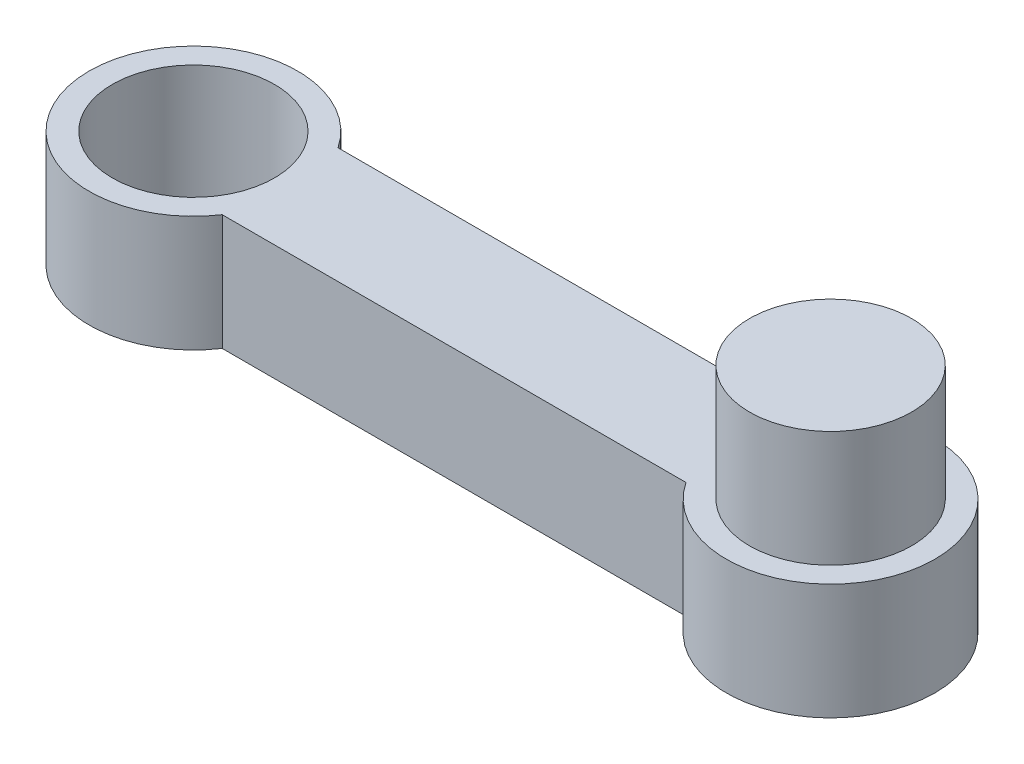
ISO-10303-21;
HEADER;
FILE_DESCRIPTION(('STEP AP214'),'2;1');
FILE_NAME('part.step','',(''),(''),'','','');
FILE_SCHEMA(('AUTOMOTIVE_DESIGN { 1 0 10303 214 1 1 1 1 }'));
ENDSEC;
DATA;
#1=APPLICATION_CONTEXT('core data for automotive mechanical design processes');
#2=APPLICATION_PROTOCOL_DEFINITION('international standard','automotive_design',2000,#1);
#3=PRODUCT_CONTEXT('',#1,'mechanical');
#4=PRODUCT('Part','Part','',(#3));
#5=PRODUCT_RELATED_PRODUCT_CATEGORY('part','',(#4));
#6=PRODUCT_DEFINITION_FORMATION('','',#4);
#7=PRODUCT_DEFINITION_CONTEXT('part definition',#1,'design');
#8=PRODUCT_DEFINITION('design','',#6,#7);
#9=PRODUCT_DEFINITION_SHAPE('','',#8);
#10=(LENGTH_UNIT() NAMED_UNIT(*) SI_UNIT(.MILLI.,.METRE.));
#11=(NAMED_UNIT(*) PLANE_ANGLE_UNIT() SI_UNIT($,.RADIAN.));
#12=(NAMED_UNIT(*) SI_UNIT($,.STERADIAN.) SOLID_ANGLE_UNIT());
#13=UNCERTAINTY_MEASURE_WITH_UNIT(LENGTH_MEASURE(1.E-05),#10,'distance_accuracy_value','');
#14=(GEOMETRIC_REPRESENTATION_CONTEXT(3) GLOBAL_UNCERTAINTY_ASSIGNED_CONTEXT((#13)) GLOBAL_UNIT_ASSIGNED_CONTEXT((#10,
#11,#12)) REPRESENTATION_CONTEXT('',''));
#15=CARTESIAN_POINT('',(0.,0.,0.));
#16=DIRECTION('',(0.,0.,1.));
#17=DIRECTION('',(1.,0.,0.));
#18=AXIS2_PLACEMENT_3D('',#15,#16,#17);
#19=CARTESIAN_POINT('',(-242.625717576026,100.,-175.992438563326));
#20=DIRECTION('',(1.,0.,-1.10744049325685E-13));
#21=DIRECTION('',(-1.10744049325685E-13,0.,-1.));
#22=AXIS2_PLACEMENT_3D('',#19,#20,#21);
#23=PLANE('',#22);
#24=DIRECTION('',(1.10744049325685E-13,0.,1.));
#25=VECTOR('',#24,1.);
#26=CARTESIAN_POINT('',(-242.625717576026,0.,-175.992438563326));
#27=LINE('',#26,#25);
#28=CARTESIAN_POINT('',(-242.625717576026,0.,-176.243066707995));
#29=VERTEX_POINT('',#28);
#30=CARTESIAN_POINT('',(-242.625717576026,0.,-175.992438563326));
#31=VERTEX_POINT('',#30);
#32=EDGE_CURVE('E146',#29,#31,#27,.T.);
#33=ORIENTED_EDGE('',*,*,#32,.T.);
#34=DIRECTION('',(0.,-1.,0.));
#35=VECTOR('',#34,1.);
#36=CARTESIAN_POINT('',(-242.625717576026,100.,-175.992438563326));
#37=LINE('',#36,#35);
#38=CARTESIAN_POINT('',(-242.625717576026,100.,-175.992438563326));
#39=VERTEX_POINT('',#38);
#40=EDGE_CURVE('E11',#39,#31,#37,.T.);
#41=ORIENTED_EDGE('',*,*,#40,.F.);
#42=DIRECTION('',(1.10744049325685E-13,0.,1.));
#43=VECTOR('',#42,1.);
#44=CARTESIAN_POINT('',(-242.625717576026,100.,-175.992438563326));
#45=LINE('',#44,#43);
#46=CARTESIAN_POINT('',(-242.625717576026,100.,-176.243066707995));
#47=VERTEX_POINT('',#46);
#48=EDGE_CURVE('E169',#47,#39,#45,.T.);
#49=ORIENTED_EDGE('',*,*,#48,.F.);
#50=DIRECTION('',(0.,-1.,0.));
#51=VECTOR('',#50,1.);
#52=CARTESIAN_POINT('',(-242.625717576026,100.,-176.243066707995));
#53=LINE('',#52,#51);
#54=EDGE_CURVE('E142',#47,#29,#53,.T.);
#55=ORIENTED_EDGE('',*,*,#54,.T.);
#56=EDGE_LOOP('',(#33,#41,#49,#55));
#57=FACE_BOUND('',#56,.T.);
#58=ADVANCED_FACE('F45',(#57),#23,.F.);
#59=CARTESIAN_POINT('',(-242.625717576026,100.,-175.992438563326));
#60=DIRECTION('',(0.,0.,-1.));
#61=DIRECTION('',(-1.,0.,0.));
#62=AXIS2_PLACEMENT_3D('',#59,#60,#61);
#63=PLANE('',#62);
#64=DIRECTION('',(1.,0.,0.));
#65=VECTOR('',#64,1.);
#66=CARTESIAN_POINT('',(-242.625717576026,0.,-175.992438563326));
#67=LINE('',#66,#65);
#68=CARTESIAN_POINT('',(157.374282423974,0.,-175.992438563326));
#69=VERTEX_POINT('',#68);
#70=EDGE_CURVE('E150',#31,#69,#67,.T.);
#71=ORIENTED_EDGE('',*,*,#70,.T.);
#72=DIRECTION('',(0.,-1.,0.));
#73=VECTOR('',#72,1.);
#74=CARTESIAN_POINT('',(157.374282423974,100.,-175.992438563326));
#75=LINE('',#74,#73);
#76=CARTESIAN_POINT('',(157.374282423974,100.,-175.992438563326));
#77=VERTEX_POINT('',#76);
#78=EDGE_CURVE('E54',#77,#69,#75,.T.);
#79=ORIENTED_EDGE('',*,*,#78,.F.);
#80=DIRECTION('',(1.,0.,0.));
#81=VECTOR('',#80,1.);
#82=CARTESIAN_POINT('',(-242.625717576026,100.,-175.992438563326));
#83=LINE('',#82,#81);
#84=EDGE_CURVE('E105',#39,#77,#83,.T.);
#85=ORIENTED_EDGE('',*,*,#84,.F.);
#86=ORIENTED_EDGE('',*,*,#40,.T.);
#87=EDGE_LOOP('',(#71,#79,#85,#86));
#88=FACE_BOUND('',#87,.T.);
#89=ADVANCED_FACE('F254',(#88),#63,.F.);
#90=CARTESIAN_POINT('',(157.374282423974,100.,-175.992438563326));
#91=DIRECTION('',(-1.,0.,0.));
#92=DIRECTION('',(0.,0.,1.));
#93=AXIS2_PLACEMENT_3D('',#90,#91,#92);
#94=PLANE('',#93);
#95=DIRECTION('',(0.,0.,-1.));
#96=VECTOR('',#95,1.);
#97=CARTESIAN_POINT('',(157.374282423974,0.,-175.992438563326));
#98=LINE('',#97,#96);
#99=CARTESIAN_POINT('',(157.374282423974,0.,-176.243066707995));
#100=VERTEX_POINT('',#99);
#101=EDGE_CURVE('E154',#69,#100,#98,.T.);
#102=ORIENTED_EDGE('',*,*,#101,.T.);
#103=DIRECTION('',(0.,-1.,0.));
#104=VECTOR('',#103,1.);
#105=CARTESIAN_POINT('',(157.374282423974,100.,-176.243066707995));
#106=LINE('',#105,#104);
#107=CARTESIAN_POINT('',(157.374282423974,100.,-176.243066707995));
#108=VERTEX_POINT('',#107);
#109=EDGE_CURVE('E180',#108,#100,#106,.T.);
#110=ORIENTED_EDGE('',*,*,#109,.F.);
#111=DIRECTION('',(0.,0.,-1.));
#112=VECTOR('',#111,1.);
#113=CARTESIAN_POINT('',(157.374282423974,100.,-175.992438563326));
#114=LINE('',#113,#112);
#115=EDGE_CURVE('E190',#77,#108,#114,.T.);
#116=ORIENTED_EDGE('',*,*,#115,.F.);
#117=ORIENTED_EDGE('',*,*,#78,.T.);
#118=EDGE_LOOP('',(#102,#110,#116,#117));
#119=FACE_BOUND('',#118,.T.);
#120=ADVANCED_FACE('F188',(#119),#94,.F.);
#121=CARTESIAN_POINT('',(232.374282423974,100.,-225.992438563326));
#122=DIRECTION('',(0.,-1.,0.));
#123=DIRECTION('',(0.,0.,-1.));
#124=AXIS2_PLACEMENT_3D('',#121,#122,#123);
#125=CYLINDRICAL_SURFACE('',#124,90.);
#126=CARTESIAN_POINT('',(232.374282423974,0.,-225.992438563326));
#127=DIRECTION('',(0.,1.,0.));
#128=DIRECTION('',(0.,0.,1.));
#129=AXIS2_PLACEMENT_3D('',#126,#127,#128);
#130=CIRCLE('',#129,90.);
#131=CARTESIAN_POINT('',(157.374282423974,0.,-275.741810418657));
#132=VERTEX_POINT('',#131);
#133=EDGE_CURVE('E157',#100,#132,#130,.T.);
#134=ORIENTED_EDGE('',*,*,#133,.T.);
#135=DIRECTION('',(0.,-1.,0.));
#136=VECTOR('',#135,1.);
#137=CARTESIAN_POINT('',(157.374282423974,100.,-275.741810418657));
#138=LINE('',#137,#136);
#139=CARTESIAN_POINT('',(157.374282423974,100.,-275.741810418657));
#140=VERTEX_POINT('',#139);
#141=EDGE_CURVE('E176',#140,#132,#138,.T.);
#142=ORIENTED_EDGE('',*,*,#141,.F.);
#143=CARTESIAN_POINT('',(232.374282423974,100.,-225.992438563326));
#144=DIRECTION('',(0.,1.,0.));
#145=DIRECTION('',(0.,0.,1.));
#146=AXIS2_PLACEMENT_3D('',#143,#144,#145);
#147=CIRCLE('',#146,90.);
#148=EDGE_CURVE('E203',#108,#140,#147,.T.);
#149=ORIENTED_EDGE('',*,*,#148,.F.);
#150=ORIENTED_EDGE('',*,*,#109,.T.);
#151=EDGE_LOOP('',(#134,#142,#149,#150));
#152=FACE_BOUND('',#151,.T.);
#153=ADVANCED_FACE('F198',(#152),#125,.T.);
#154=CARTESIAN_POINT('',(157.374282423974,100.,-275.741810418657));
#155=DIRECTION('',(-1.,0.,0.));
#156=DIRECTION('',(0.,0.,1.));
#157=AXIS2_PLACEMENT_3D('',#154,#155,#156);
#158=PLANE('',#157);
#159=DIRECTION('',(0.,0.,-1.));
#160=VECTOR('',#159,1.);
#161=CARTESIAN_POINT('',(157.374282423974,0.,-275.741810418657));
#162=LINE('',#161,#160);
#163=CARTESIAN_POINT('',(157.374282423974,0.,-275.992438563326));
#164=VERTEX_POINT('',#163);
#165=EDGE_CURVE('E160',#132,#164,#162,.T.);
#166=ORIENTED_EDGE('',*,*,#165,.T.);
#167=DIRECTION('',(0.,-1.,0.));
#168=VECTOR('',#167,1.);
#169=CARTESIAN_POINT('',(157.374282423974,100.,-275.992438563326));
#170=LINE('',#169,#168);
#171=CARTESIAN_POINT('',(157.374282423974,100.,-275.992438563326));
#172=VERTEX_POINT('',#171);
#173=EDGE_CURVE('E135',#172,#164,#170,.T.);
#174=ORIENTED_EDGE('',*,*,#173,.F.);
#175=DIRECTION('',(0.,0.,-1.));
#176=VECTOR('',#175,1.);
#177=CARTESIAN_POINT('',(157.374282423974,100.,-275.741810418657));
#178=LINE('',#177,#176);
#179=EDGE_CURVE('E124',#140,#172,#178,.T.);
#180=ORIENTED_EDGE('',*,*,#179,.F.);
#181=ORIENTED_EDGE('',*,*,#141,.T.);
#182=EDGE_LOOP('',(#166,#174,#180,#181));
#183=FACE_BOUND('',#182,.T.);
#184=ADVANCED_FACE('F201',(#183),#158,.F.);
#185=CARTESIAN_POINT('',(-242.625717576026,100.,-275.992438563326));
#186=DIRECTION('',(0.,0.,1.));
#187=DIRECTION('',(1.,0.,0.));
#188=AXIS2_PLACEMENT_3D('',#185,#186,#187);
#189=PLANE('',#188);
#190=DIRECTION('',(-1.,0.,0.));
#191=VECTOR('',#190,1.);
#192=CARTESIAN_POINT('',(-242.625717576026,0.,-275.992438563326));
#193=LINE('',#192,#191);
#194=CARTESIAN_POINT('',(-242.625717576026,0.,-275.992438563326));
#195=VERTEX_POINT('',#194);
#196=EDGE_CURVE('E133',#164,#195,#193,.T.);
#197=ORIENTED_EDGE('',*,*,#196,.T.);
#198=DIRECTION('',(0.,-1.,0.));
#199=VECTOR('',#198,1.);
#200=CARTESIAN_POINT('',(-242.625717576026,100.,-275.992438563326));
#201=LINE('',#200,#199);
#202=CARTESIAN_POINT('',(-242.625717576026,100.,-275.992438563326));
#203=VERTEX_POINT('',#202);
#204=EDGE_CURVE('E130',#203,#195,#201,.T.);
#205=ORIENTED_EDGE('',*,*,#204,.F.);
#206=DIRECTION('',(-1.,0.,0.));
#207=VECTOR('',#206,1.);
#208=CARTESIAN_POINT('',(-242.625717576026,100.,-275.992438563326));
#209=LINE('',#208,#207);
#210=EDGE_CURVE('E118',#172,#203,#209,.T.);
#211=ORIENTED_EDGE('',*,*,#210,.F.);
#212=ORIENTED_EDGE('',*,*,#173,.T.);
#213=EDGE_LOOP('',(#197,#205,#211,#212));
#214=FACE_BOUND('',#213,.T.);
#215=ADVANCED_FACE('F131',(#214),#189,.F.);
#216=CARTESIAN_POINT('',(-242.625717576026,100.,-275.741810418657));
#217=DIRECTION('',(1.,0.,0.));
#218=DIRECTION('',(0.,0.,-1.));
#219=AXIS2_PLACEMENT_3D('',#216,#217,#218);
#220=PLANE('',#219);
#221=DIRECTION('',(0.,0.,1.));
#222=VECTOR('',#221,1.);
#223=CARTESIAN_POINT('',(-242.625717576026,0.,-275.741810418657));
#224=LINE('',#223,#222);
#225=CARTESIAN_POINT('',(-242.625717576026,0.,-275.741810418657));
#226=VERTEX_POINT('',#225);
#227=EDGE_CURVE('E91',#195,#226,#224,.T.);
#228=ORIENTED_EDGE('',*,*,#227,.T.);
#229=DIRECTION('',(0.,-1.,0.));
#230=VECTOR('',#229,1.);
#231=CARTESIAN_POINT('',(-242.625717576026,100.,-275.741810418657));
#232=LINE('',#231,#230);
#233=CARTESIAN_POINT('',(-242.625717576026,100.,-275.741810418657));
#234=VERTEX_POINT('',#233);
#235=EDGE_CURVE('E136',#234,#226,#232,.T.);
#236=ORIENTED_EDGE('',*,*,#235,.F.);
#237=DIRECTION('',(0.,0.,1.));
#238=VECTOR('',#237,1.);
#239=CARTESIAN_POINT('',(-242.625717576026,100.,-275.741810418657));
#240=LINE('',#239,#238);
#241=EDGE_CURVE('E122',#203,#234,#240,.T.);
#242=ORIENTED_EDGE('',*,*,#241,.F.);
#243=ORIENTED_EDGE('',*,*,#204,.T.);
#244=EDGE_LOOP('',(#228,#236,#242,#243));
#245=FACE_BOUND('',#244,.T.);
#246=ADVANCED_FACE('F138',(#245),#220,.F.);
#247=CARTESIAN_POINT('',(-317.625717576026,100.,-225.992438563326));
#248=DIRECTION('',(0.,-1.,0.));
#249=DIRECTION('',(0.,0.,-1.));
#250=AXIS2_PLACEMENT_3D('',#247,#248,#249);
#251=CYLINDRICAL_SURFACE('',#250,90.);
#252=CARTESIAN_POINT('',(-317.625717576026,0.,-225.992438563326));
#253=DIRECTION('',(0.,1.,0.));
#254=DIRECTION('',(0.,0.,1.));
#255=AXIS2_PLACEMENT_3D('',#252,#253,#254);
#256=CIRCLE('',#255,90.);
#257=EDGE_CURVE('E97',#226,#29,#256,.T.);
#258=ORIENTED_EDGE('',*,*,#257,.T.);
#259=ORIENTED_EDGE('',*,*,#54,.F.);
#260=CARTESIAN_POINT('',(-317.625717576026,100.,-225.992438563326));
#261=DIRECTION('',(0.,1.,0.));
#262=DIRECTION('',(0.,0.,1.));
#263=AXIS2_PLACEMENT_3D('',#260,#261,#262);
#264=CIRCLE('',#263,90.);
#265=EDGE_CURVE('E62',#234,#47,#264,.T.);
#266=ORIENTED_EDGE('',*,*,#265,.F.);
#267=ORIENTED_EDGE('',*,*,#235,.T.);
#268=EDGE_LOOP('',(#258,#259,#266,#267));
#269=FACE_BOUND('',#268,.T.);
#270=ADVANCED_FACE('F240',(#269),#251,.T.);
#271=CARTESIAN_POINT('',(-317.625717576026,100.,-225.992438563326));
#272=DIRECTION('',(0.,1.,0.));
#273=DIRECTION('',(0.,0.,1.));
#274=AXIS2_PLACEMENT_3D('',#271,#272,#273);
#275=PLANE('',#274);
#276=CARTESIAN_POINT('',(232.374282423974,100.,-225.992438563326));
#277=DIRECTION('',(0.,1.,0.));
#278=DIRECTION('',(0.,0.,1.));
#279=AXIS2_PLACEMENT_3D('',#276,#277,#278);
#280=CIRCLE('',#279,70.0000000000001);
#281=CARTESIAN_POINT('',(232.374282423974,100.,-155.992438563326));
#282=VERTEX_POINT('',#281);
#283=EDGE_CURVE('E221',#282,#282,#280,.T.);
#284=ORIENTED_EDGE('',*,*,#283,.F.);
#285=EDGE_LOOP('',(#284));
#286=FACE_BOUND('',#285,.T.);
#287=CARTESIAN_POINT('',(-317.625717576026,100.,-225.992438563326));
#288=DIRECTION('',(0.,1.,0.));
#289=DIRECTION('',(0.,0.,1.));
#290=AXIS2_PLACEMENT_3D('',#287,#288,#289);
#291=CIRCLE('',#290,70.);
#292=CARTESIAN_POINT('',(-317.625717576026,100.,-155.992438563326));
#293=VERTEX_POINT('',#292);
#294=EDGE_CURVE('E213',#293,#293,#291,.T.);
#295=ORIENTED_EDGE('',*,*,#294,.F.);
#296=EDGE_LOOP('',(#295));
#297=FACE_BOUND('',#296,.T.);
#298=ORIENTED_EDGE('',*,*,#48,.T.);
#299=ORIENTED_EDGE('',*,*,#84,.T.);
#300=ORIENTED_EDGE('',*,*,#115,.T.);
#301=ORIENTED_EDGE('',*,*,#148,.T.);
#302=ORIENTED_EDGE('',*,*,#179,.T.);
#303=ORIENTED_EDGE('',*,*,#210,.T.);
#304=ORIENTED_EDGE('',*,*,#241,.T.);
#305=ORIENTED_EDGE('',*,*,#265,.T.);
#306=EDGE_LOOP('',(#298,#299,#300,#301,#302,#303,#304,#305));
#307=FACE_BOUND('',#306,.T.);
#308=ADVANCED_FACE('F120',(#286,#297,#307),#275,.T.);
#309=CARTESIAN_POINT('',(-317.625717576026,0.,-225.992438563326));
#310=DIRECTION('',(0.,1.,0.));
#311=DIRECTION('',(0.,0.,1.));
#312=AXIS2_PLACEMENT_3D('',#309,#310,#311);
#313=PLANE('',#312);
#314=CARTESIAN_POINT('',(-317.625717576026,0.,-225.992438563326));
#315=DIRECTION('',(0.,1.,0.));
#316=DIRECTION('',(0.,0.,1.));
#317=AXIS2_PLACEMENT_3D('',#314,#315,#316);
#318=CIRCLE('',#317,70.);
#319=CARTESIAN_POINT('',(-317.625717576026,0.,-155.992438563326));
#320=VERTEX_POINT('',#319);
#321=EDGE_CURVE('E151',#320,#320,#318,.T.);
#322=ORIENTED_EDGE('',*,*,#321,.T.);
#323=EDGE_LOOP('',(#322));
#324=FACE_BOUND('',#323,.T.);
#325=ORIENTED_EDGE('',*,*,#32,.F.);
#326=ORIENTED_EDGE('',*,*,#257,.F.);
#327=ORIENTED_EDGE('',*,*,#227,.F.);
#328=ORIENTED_EDGE('',*,*,#196,.F.);
#329=ORIENTED_EDGE('',*,*,#165,.F.);
#330=ORIENTED_EDGE('',*,*,#133,.F.);
#331=ORIENTED_EDGE('',*,*,#101,.F.);
#332=ORIENTED_EDGE('',*,*,#70,.F.);
#333=EDGE_LOOP('',(#325,#326,#327,#328,#329,#330,#331,#332));
#334=FACE_BOUND('',#333,.T.);
#335=ADVANCED_FACE('F194',(#324,#334),#313,.F.);
#336=CARTESIAN_POINT('',(-317.625717576026,0.,-225.992438563326));
#337=DIRECTION('',(0.,1.,0.));
#338=DIRECTION('',(0.,0.,1.));
#339=AXIS2_PLACEMENT_3D('',#336,#337,#338);
#340=CYLINDRICAL_SURFACE('',#339,70.);
#341=ORIENTED_EDGE('',*,*,#321,.F.);
#342=EDGE_LOOP('',(#341));
#343=FACE_BOUND('',#342,.T.);
#344=ORIENTED_EDGE('',*,*,#294,.T.);
#345=EDGE_LOOP('',(#344));
#346=FACE_BOUND('',#345,.T.);
#347=ADVANCED_FACE('F234',(#343,#346),#340,.F.);
#348=CARTESIAN_POINT('',(232.374282423974,200.,-225.992438563326));
#349=DIRECTION('',(0.,-1.,0.));
#350=DIRECTION('',(0.,0.,-1.));
#351=AXIS2_PLACEMENT_3D('',#348,#349,#350);
#352=CYLINDRICAL_SURFACE('',#351,70.0000000000001);
#353=CARTESIAN_POINT('',(232.374282423974,200.,-225.992438563326));
#354=DIRECTION('',(0.,1.,0.));
#355=DIRECTION('',(0.,0.,1.));
#356=AXIS2_PLACEMENT_3D('',#353,#354,#355);
#357=CIRCLE('',#356,70.0000000000001);
#358=CARTESIAN_POINT('',(232.374282423974,200.,-155.992438563326));
#359=VERTEX_POINT('',#358);
#360=EDGE_CURVE('E217',#359,#359,#357,.T.);
#361=ORIENTED_EDGE('',*,*,#360,.F.);
#362=EDGE_LOOP('',(#361));
#363=FACE_BOUND('',#362,.T.);
#364=ORIENTED_EDGE('',*,*,#283,.T.);
#365=EDGE_LOOP('',(#364));
#366=FACE_BOUND('',#365,.T.);
#367=ADVANCED_FACE('F231',(#363,#366),#352,.T.);
#368=CARTESIAN_POINT('',(232.374282423974,200.,-225.992438563326));
#369=DIRECTION('',(0.,1.,0.));
#370=DIRECTION('',(0.,0.,1.));
#371=AXIS2_PLACEMENT_3D('',#368,#369,#370);
#372=PLANE('',#371);
#373=ORIENTED_EDGE('',*,*,#360,.T.);
#374=EDGE_LOOP('',(#373));
#375=FACE_BOUND('',#374,.T.);
#376=ADVANCED_FACE('F229',(#375),#372,.T.);
#377=CLOSED_SHELL('',(#58,#89,#120,#153,#184,#215,#246,#270,#308,#335,#347,#367,#376));
#378=MANIFOLD_SOLID_BREP('B2',#377);
#379=ADVANCED_BREP_SHAPE_REPRESENTATION('',(#18,#378),#14);
#380=SHAPE_DEFINITION_REPRESENTATION(#9,#379);
ENDSEC;
END-ISO-10303-21;
